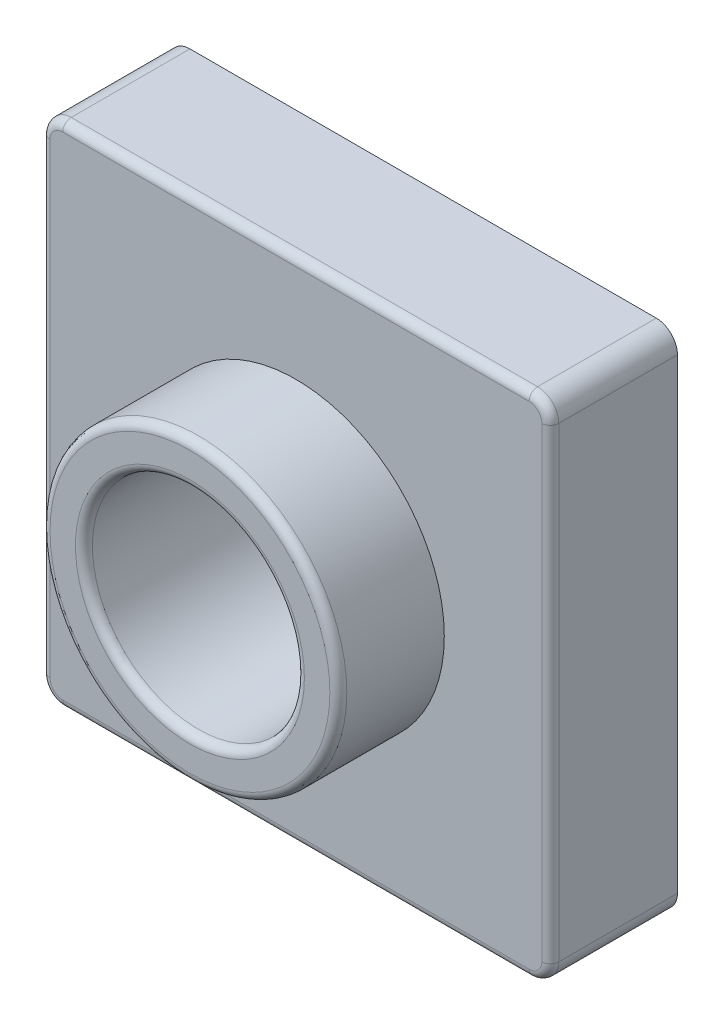
ISO-10303-21;
HEADER;
FILE_DESCRIPTION(('STEP AP214'),'2;1');
FILE_NAME('part.step','',(''),(''),'','','');
FILE_SCHEMA(('AUTOMOTIVE_DESIGN { 1 0 10303 214 1 1 1 1 }'));
ENDSEC;
DATA;
#1=APPLICATION_CONTEXT('core data for automotive mechanical design processes');
#2=APPLICATION_PROTOCOL_DEFINITION('international standard','automotive_design',2000,#1);
#3=PRODUCT_CONTEXT('',#1,'mechanical');
#4=PRODUCT('Part','Part','',(#3));
#5=PRODUCT_RELATED_PRODUCT_CATEGORY('part','',(#4));
#6=PRODUCT_DEFINITION_FORMATION('','',#4);
#7=PRODUCT_DEFINITION_CONTEXT('part definition',#1,'design');
#8=PRODUCT_DEFINITION('design','',#6,#7);
#9=PRODUCT_DEFINITION_SHAPE('','',#8);
#10=(LENGTH_UNIT() NAMED_UNIT(*) SI_UNIT(.MILLI.,.METRE.));
#11=(NAMED_UNIT(*) PLANE_ANGLE_UNIT() SI_UNIT($,.RADIAN.));
#12=(NAMED_UNIT(*) SI_UNIT($,.STERADIAN.) SOLID_ANGLE_UNIT());
#13=UNCERTAINTY_MEASURE_WITH_UNIT(LENGTH_MEASURE(1.E-05),#10,'distance_accuracy_value','');
#14=(GEOMETRIC_REPRESENTATION_CONTEXT(3) GLOBAL_UNCERTAINTY_ASSIGNED_CONTEXT((#13)) GLOBAL_UNIT_ASSIGNED_CONTEXT((#10,
#11,#12)) REPRESENTATION_CONTEXT('',''));
#15=CARTESIAN_POINT('',(0.,0.,0.));
#16=DIRECTION('',(0.,0.,1.));
#17=DIRECTION('',(1.,0.,0.));
#18=AXIS2_PLACEMENT_3D('',#15,#16,#17);
#19=CARTESIAN_POINT('',(0.,0.,0.));
#20=DIRECTION('',(0.,0.,-1.));
#21=DIRECTION('',(-1.,0.,0.));
#22=AXIS2_PLACEMENT_3D('',#19,#20,#21);
#23=PLANE('',#22);
#24=CARTESIAN_POINT('',(60.,60.,0.));
#25=DIRECTION('',(0.,0.,-1.));
#26=DIRECTION('',(-1.,0.,0.));
#27=AXIS2_PLACEMENT_3D('',#24,#25,#26);
#28=CIRCLE('',#27,25.);
#29=CARTESIAN_POINT('',(35.,60.,0.));
#30=VERTEX_POINT('',#29);
#31=EDGE_CURVE('E259',#30,#30,#28,.T.);
#32=ORIENTED_EDGE('',*,*,#31,.F.);
#33=EDGE_LOOP('',(#32));
#34=FACE_BOUND('',#33,.T.);
#35=CARTESIAN_POINT('',(60.,60.,0.));
#36=DIRECTION('',(0.,0.,-1.));
#37=DIRECTION('',(-1.,0.,0.));
#38=AXIS2_PLACEMENT_3D('',#35,#36,#37);
#39=CIRCLE('',#38,27.);
#40=CARTESIAN_POINT('',(33.,60.,0.));
#41=VERTEX_POINT('',#40);
#42=EDGE_CURVE('E245',#41,#41,#39,.T.);
#43=ORIENTED_EDGE('',*,*,#42,.T.);
#44=EDGE_LOOP('',(#43));
#45=FACE_BOUND('',#44,.T.);
#46=ADVANCED_FACE('F35',(#34,#45),#23,.T.);
#47=DIRECTION('',(1.,0.,0.));
#48=VECTOR('',#47,1.);
#49=CARTESIAN_POINT('',(0.,0.,0.));
#50=LINE('',#49,#48);
#51=CARTESIAN_POINT('',(5.,0.,0.));
#52=VERTEX_POINT('',#51);
#53=CARTESIAN_POINT('',(115.,0.,0.));
#54=VERTEX_POINT('',#53);
#55=EDGE_CURVE('E265',#52,#54,#50,.T.);
#56=ORIENTED_EDGE('',*,*,#55,.F.);
#57=CARTESIAN_POINT('',(5.,5.,0.));
#58=DIRECTION('',(0.,0.,-1.));
#59=DIRECTION('',(-1.,0.,0.));
#60=AXIS2_PLACEMENT_3D('',#57,#58,#59);
#61=CIRCLE('',#60,5.);
#62=CARTESIAN_POINT('',(0.,5.,0.));
#63=VERTEX_POINT('',#62);
#64=EDGE_CURVE('E287',#52,#63,#61,.T.);
#65=ORIENTED_EDGE('',*,*,#64,.T.);
#66=DIRECTION('',(0.,-1.,0.));
#67=VECTOR('',#66,1.);
#68=CARTESIAN_POINT('',(0.,0.,0.));
#69=LINE('',#68,#67);
#70=CARTESIAN_POINT('',(0.,115.,0.));
#71=VERTEX_POINT('',#70);
#72=EDGE_CURVE('E262',#71,#63,#69,.T.);
#73=ORIENTED_EDGE('',*,*,#72,.F.);
#74=CARTESIAN_POINT('',(5.,115.,0.));
#75=DIRECTION('',(0.,0.,-1.));
#76=DIRECTION('',(-1.,0.,0.));
#77=AXIS2_PLACEMENT_3D('',#74,#75,#76);
#78=CIRCLE('',#77,5.);
#79=CARTESIAN_POINT('',(5.,120.,0.));
#80=VERTEX_POINT('',#79);
#81=EDGE_CURVE('E281',#71,#80,#78,.T.);
#82=ORIENTED_EDGE('',*,*,#81,.T.);
#83=DIRECTION('',(-1.,0.,0.));
#84=VECTOR('',#83,1.);
#85=CARTESIAN_POINT('',(0.,120.,0.));
#86=LINE('',#85,#84);
#87=CARTESIAN_POINT('',(115.,120.,0.));
#88=VERTEX_POINT('',#87);
#89=EDGE_CURVE('E271',#88,#80,#86,.T.);
#90=ORIENTED_EDGE('',*,*,#89,.F.);
#91=CARTESIAN_POINT('',(115.,115.,0.));
#92=DIRECTION('',(0.,0.,-1.));
#93=DIRECTION('',(-1.,0.,0.));
#94=AXIS2_PLACEMENT_3D('',#91,#92,#93);
#95=CIRCLE('',#94,5.);
#96=CARTESIAN_POINT('',(120.,115.,0.));
#97=VERTEX_POINT('',#96);
#98=EDGE_CURVE('E283',#88,#97,#95,.T.);
#99=ORIENTED_EDGE('',*,*,#98,.T.);
#100=DIRECTION('',(0.,1.,0.));
#101=VECTOR('',#100,1.);
#102=CARTESIAN_POINT('',(120.,0.,0.));
#103=LINE('',#102,#101);
#104=CARTESIAN_POINT('',(120.,5.,0.));
#105=VERTEX_POINT('',#104);
#106=EDGE_CURVE('E268',#105,#97,#103,.T.);
#107=ORIENTED_EDGE('',*,*,#106,.F.);
#108=CARTESIAN_POINT('',(115.,5.,0.));
#109=DIRECTION('',(0.,0.,-1.));
#110=DIRECTION('',(-1.,0.,0.));
#111=AXIS2_PLACEMENT_3D('',#108,#109,#110);
#112=CIRCLE('',#111,5.);
#113=EDGE_CURVE('E285',#105,#54,#112,.T.);
#114=ORIENTED_EDGE('',*,*,#113,.T.);
#115=EDGE_LOOP('',(#56,#65,#73,#82,#90,#99,#107,#114));
#116=FACE_BOUND('',#115,.T.);
#117=CARTESIAN_POINT('',(5.,5.,0.));
#118=DIRECTION('',(0.,0.,-1.));
#119=DIRECTION('',(-1.,0.,0.));
#120=AXIS2_PLACEMENT_3D('',#117,#118,#119);
#121=CIRCLE('',#120,3.);
#122=CARTESIAN_POINT('',(5.,2.,0.));
#123=VERTEX_POINT('',#122);
#124=CARTESIAN_POINT('',(2.,5.,0.));
#125=VERTEX_POINT('',#124);
#126=EDGE_CURVE('E200',#123,#125,#121,.T.);
#127=ORIENTED_EDGE('',*,*,#126,.F.);
#128=DIRECTION('',(1.,0.,0.));
#129=VECTOR('',#128,1.);
#130=CARTESIAN_POINT('',(0.,2.,0.));
#131=LINE('',#130,#129);
#132=CARTESIAN_POINT('',(115.,2.,0.));
#133=VERTEX_POINT('',#132);
#134=EDGE_CURVE('E244',#123,#133,#131,.T.);
#135=ORIENTED_EDGE('',*,*,#134,.T.);
#136=CARTESIAN_POINT('',(115.,5.,0.));
#137=DIRECTION('',(0.,0.,-1.));
#138=DIRECTION('',(-1.,0.,0.));
#139=AXIS2_PLACEMENT_3D('',#136,#137,#138);
#140=CIRCLE('',#139,3.);
#141=CARTESIAN_POINT('',(118.,5.,0.));
#142=VERTEX_POINT('',#141);
#143=EDGE_CURVE('E251',#142,#133,#140,.T.);
#144=ORIENTED_EDGE('',*,*,#143,.F.);
#145=DIRECTION('',(0.,1.,0.));
#146=VECTOR('',#145,1.);
#147=CARTESIAN_POINT('',(118.,0.,0.));
#148=LINE('',#147,#146);
#149=CARTESIAN_POINT('',(118.,115.,0.));
#150=VERTEX_POINT('',#149);
#151=EDGE_CURVE('E52',#142,#150,#148,.T.);
#152=ORIENTED_EDGE('',*,*,#151,.T.);
#153=CARTESIAN_POINT('',(115.,115.,0.));
#154=DIRECTION('',(0.,0.,-1.));
#155=DIRECTION('',(-1.,0.,0.));
#156=AXIS2_PLACEMENT_3D('',#153,#154,#155);
#157=CIRCLE('',#156,3.);
#158=CARTESIAN_POINT('',(115.,118.,0.));
#159=VERTEX_POINT('',#158);
#160=EDGE_CURVE('E247',#159,#150,#157,.T.);
#161=ORIENTED_EDGE('',*,*,#160,.F.);
#162=DIRECTION('',(-1.,0.,0.));
#163=VECTOR('',#162,1.);
#164=CARTESIAN_POINT('',(0.,118.,0.));
#165=LINE('',#164,#163);
#166=CARTESIAN_POINT('',(5.,118.,0.));
#167=VERTEX_POINT('',#166);
#168=EDGE_CURVE('E226',#159,#167,#165,.T.);
#169=ORIENTED_EDGE('',*,*,#168,.T.);
#170=CARTESIAN_POINT('',(5.,115.,0.));
#171=DIRECTION('',(0.,0.,-1.));
#172=DIRECTION('',(-1.,0.,0.));
#173=AXIS2_PLACEMENT_3D('',#170,#171,#172);
#174=CIRCLE('',#173,3.);
#175=CARTESIAN_POINT('',(2.,115.,0.));
#176=VERTEX_POINT('',#175);
#177=EDGE_CURVE('E231',#176,#167,#174,.T.);
#178=ORIENTED_EDGE('',*,*,#177,.F.);
#179=DIRECTION('',(0.,-1.,0.));
#180=VECTOR('',#179,1.);
#181=CARTESIAN_POINT('',(2.,0.,0.));
#182=LINE('',#181,#180);
#183=EDGE_CURVE('E242',#176,#125,#182,.T.);
#184=ORIENTED_EDGE('',*,*,#183,.T.);
#185=EDGE_LOOP('',(#127,#135,#144,#152,#161,#169,#178,#184));
#186=FACE_BOUND('',#185,.T.);
#187=ADVANCED_FACE('F384',(#116,#186),#23,.T.);
#188=CARTESIAN_POINT('',(0.,0.,30.));
#189=DIRECTION('',(1.,0.,0.));
#190=DIRECTION('',(0.,0.,-1.));
#191=AXIS2_PLACEMENT_3D('',#188,#189,#190);
#192=PLANE('',#191);
#193=DIRECTION('',(0.,0.,-1.));
#194=VECTOR('',#193,1.);
#195=CARTESIAN_POINT('',(0.,5.,30.));
#196=LINE('',#195,#194);
#197=CARTESIAN_POINT('',(0.,5.,28.));
#198=VERTEX_POINT('',#197);
#199=EDGE_CURVE('E291',#63,#198,#196,.F.);
#200=ORIENTED_EDGE('',*,*,#199,.T.);
#201=DIRECTION('',(0.,-1.,0.));
#202=VECTOR('',#201,1.);
#203=CARTESIAN_POINT('',(0.,0.,28.));
#204=LINE('',#203,#202);
#205=CARTESIAN_POINT('',(0.,115.,28.));
#206=VERTEX_POINT('',#205);
#207=EDGE_CURVE('E335',#198,#206,#204,.F.);
#208=ORIENTED_EDGE('',*,*,#207,.T.);
#209=DIRECTION('',(0.,0.,-1.));
#210=VECTOR('',#209,1.);
#211=CARTESIAN_POINT('',(0.,115.,30.));
#212=LINE('',#211,#210);
#213=EDGE_CURVE('E289',#206,#71,#212,.T.);
#214=ORIENTED_EDGE('',*,*,#213,.T.);
#215=ORIENTED_EDGE('',*,*,#72,.T.);
#216=EDGE_LOOP('',(#200,#208,#214,#215));
#217=FACE_BOUND('',#216,.T.);
#218=ADVANCED_FACE('F422',(#217),#192,.F.);
#219=CARTESIAN_POINT('',(0.,0.,30.));
#220=DIRECTION('',(0.,1.,0.));
#221=DIRECTION('',(0.,0.,1.));
#222=AXIS2_PLACEMENT_3D('',#219,#220,#221);
#223=PLANE('',#222);
#224=DIRECTION('',(0.,0.,-1.));
#225=VECTOR('',#224,1.);
#226=CARTESIAN_POINT('',(115.,0.,30.));
#227=LINE('',#226,#225);
#228=CARTESIAN_POINT('',(115.,0.,28.));
#229=VERTEX_POINT('',#228);
#230=EDGE_CURVE('E277',#54,#229,#227,.F.);
#231=ORIENTED_EDGE('',*,*,#230,.T.);
#232=DIRECTION('',(1.,0.,0.));
#233=VECTOR('',#232,1.);
#234=CARTESIAN_POINT('',(0.,0.,28.));
#235=LINE('',#234,#233);
#236=CARTESIAN_POINT('',(5.,0.,28.));
#237=VERTEX_POINT('',#236);
#238=EDGE_CURVE('E60',#229,#237,#235,.F.);
#239=ORIENTED_EDGE('',*,*,#238,.T.);
#240=DIRECTION('',(0.,0.,-1.));
#241=VECTOR('',#240,1.);
#242=CARTESIAN_POINT('',(5.,0.,30.));
#243=LINE('',#242,#241);
#244=EDGE_CURVE('E279',#237,#52,#243,.T.);
#245=ORIENTED_EDGE('',*,*,#244,.T.);
#246=ORIENTED_EDGE('',*,*,#55,.T.);
#247=EDGE_LOOP('',(#231,#239,#245,#246));
#248=FACE_BOUND('',#247,.T.);
#249=ADVANCED_FACE('F380',(#248),#223,.F.);
#250=CARTESIAN_POINT('',(120.,0.,30.));
#251=DIRECTION('',(-1.,0.,0.));
#252=DIRECTION('',(0.,0.,1.));
#253=AXIS2_PLACEMENT_3D('',#250,#251,#252);
#254=PLANE('',#253);
#255=DIRECTION('',(0.,0.,-1.));
#256=VECTOR('',#255,1.);
#257=CARTESIAN_POINT('',(120.,115.,30.));
#258=LINE('',#257,#256);
#259=CARTESIAN_POINT('',(120.,115.,28.));
#260=VERTEX_POINT('',#259);
#261=EDGE_CURVE('E294',#97,#260,#258,.F.);
#262=ORIENTED_EDGE('',*,*,#261,.T.);
#263=DIRECTION('',(0.,1.,0.));
#264=VECTOR('',#263,1.);
#265=CARTESIAN_POINT('',(120.,0.,28.));
#266=LINE('',#265,#264);
#267=CARTESIAN_POINT('',(120.,5.,28.));
#268=VERTEX_POINT('',#267);
#269=EDGE_CURVE('E330',#260,#268,#266,.F.);
#270=ORIENTED_EDGE('',*,*,#269,.T.);
#271=DIRECTION('',(0.,0.,-1.));
#272=VECTOR('',#271,1.);
#273=CARTESIAN_POINT('',(120.,5.,30.));
#274=LINE('',#273,#272);
#275=EDGE_CURVE('E297',#268,#105,#274,.T.);
#276=ORIENTED_EDGE('',*,*,#275,.T.);
#277=ORIENTED_EDGE('',*,*,#106,.T.);
#278=EDGE_LOOP('',(#262,#270,#276,#277));
#279=FACE_BOUND('',#278,.T.);
#280=ADVANCED_FACE('F392',(#279),#254,.F.);
#281=CARTESIAN_POINT('',(0.,120.,30.));
#282=DIRECTION('',(0.,-1.,0.));
#283=DIRECTION('',(0.,0.,-1.));
#284=AXIS2_PLACEMENT_3D('',#281,#282,#283);
#285=PLANE('',#284);
#286=DIRECTION('',(0.,0.,-1.));
#287=VECTOR('',#286,1.);
#288=CARTESIAN_POINT('',(5.,120.,30.));
#289=LINE('',#288,#287);
#290=CARTESIAN_POINT('',(5.,120.,28.));
#291=VERTEX_POINT('',#290);
#292=EDGE_CURVE('E299',#80,#291,#289,.F.);
#293=ORIENTED_EDGE('',*,*,#292,.T.);
#294=DIRECTION('',(-1.,0.,0.));
#295=VECTOR('',#294,1.);
#296=CARTESIAN_POINT('',(0.,120.,28.));
#297=LINE('',#296,#295);
#298=CARTESIAN_POINT('',(115.,120.,28.));
#299=VERTEX_POINT('',#298);
#300=EDGE_CURVE('E333',#291,#299,#297,.F.);
#301=ORIENTED_EDGE('',*,*,#300,.T.);
#302=DIRECTION('',(0.,0.,-1.));
#303=VECTOR('',#302,1.);
#304=CARTESIAN_POINT('',(115.,120.,30.));
#305=LINE('',#304,#303);
#306=EDGE_CURVE('E302',#299,#88,#305,.T.);
#307=ORIENTED_EDGE('',*,*,#306,.T.);
#308=ORIENTED_EDGE('',*,*,#89,.T.);
#309=EDGE_LOOP('',(#293,#301,#307,#308));
#310=FACE_BOUND('',#309,.T.);
#311=ADVANCED_FACE('F428',(#310),#285,.F.);
#312=CARTESIAN_POINT('',(0.,0.,30.));
#313=DIRECTION('',(0.,0.,-1.));
#314=DIRECTION('',(-1.,0.,0.));
#315=AXIS2_PLACEMENT_3D('',#312,#313,#314);
#316=PLANE('',#315);
#317=CARTESIAN_POINT('',(115.,5.,30.));
#318=DIRECTION('',(0.,0.,-1.));
#319=DIRECTION('',(-1.,0.,0.));
#320=AXIS2_PLACEMENT_3D('',#317,#318,#319);
#321=CIRCLE('',#320,3.);
#322=CARTESIAN_POINT('',(115.,2.,30.));
#323=VERTEX_POINT('',#322);
#324=CARTESIAN_POINT('',(118.,5.,30.));
#325=VERTEX_POINT('',#324);
#326=EDGE_CURVE('E315',#323,#325,#321,.F.);
#327=ORIENTED_EDGE('',*,*,#326,.T.);
#328=DIRECTION('',(0.,1.,0.));
#329=VECTOR('',#328,1.);
#330=CARTESIAN_POINT('',(118.,0.,30.));
#331=LINE('',#330,#329);
#332=CARTESIAN_POINT('',(118.,115.,30.));
#333=VERTEX_POINT('',#332);
#334=EDGE_CURVE('E319',#325,#333,#331,.T.);
#335=ORIENTED_EDGE('',*,*,#334,.T.);
#336=CARTESIAN_POINT('',(115.,115.,30.));
#337=DIRECTION('',(0.,0.,-1.));
#338=DIRECTION('',(-1.,0.,0.));
#339=AXIS2_PLACEMENT_3D('',#336,#337,#338);
#340=CIRCLE('',#339,3.);
#341=CARTESIAN_POINT('',(115.,118.,30.));
#342=VERTEX_POINT('',#341);
#343=EDGE_CURVE('E317',#333,#342,#340,.F.);
#344=ORIENTED_EDGE('',*,*,#343,.T.);
#345=DIRECTION('',(-1.,0.,0.));
#346=VECTOR('',#345,1.);
#347=CARTESIAN_POINT('',(0.,118.,30.));
#348=LINE('',#347,#346);
#349=CARTESIAN_POINT('',(5.,118.,30.));
#350=VERTEX_POINT('',#349);
#351=EDGE_CURVE('E311',#342,#350,#348,.T.);
#352=ORIENTED_EDGE('',*,*,#351,.T.);
#353=CARTESIAN_POINT('',(5.,115.,30.));
#354=DIRECTION('',(0.,0.,-1.));
#355=DIRECTION('',(-1.,0.,0.));
#356=AXIS2_PLACEMENT_3D('',#353,#354,#355);
#357=CIRCLE('',#356,3.);
#358=CARTESIAN_POINT('',(2.,115.,30.));
#359=VERTEX_POINT('',#358);
#360=EDGE_CURVE('E308',#350,#359,#357,.F.);
#361=ORIENTED_EDGE('',*,*,#360,.T.);
#362=DIRECTION('',(0.,-1.,0.));
#363=VECTOR('',#362,1.);
#364=CARTESIAN_POINT('',(2.,0.,30.));
#365=LINE('',#364,#363);
#366=CARTESIAN_POINT('',(2.,5.,30.));
#367=VERTEX_POINT('',#366);
#368=EDGE_CURVE('E304',#359,#367,#365,.T.);
#369=ORIENTED_EDGE('',*,*,#368,.T.);
#370=CARTESIAN_POINT('',(5.,5.,30.));
#371=DIRECTION('',(0.,0.,-1.));
#372=DIRECTION('',(-1.,0.,0.));
#373=AXIS2_PLACEMENT_3D('',#370,#371,#372);
#374=CIRCLE('',#373,3.);
#375=CARTESIAN_POINT('',(5.,2.,30.));
#376=VERTEX_POINT('',#375);
#377=EDGE_CURVE('E306',#367,#376,#374,.F.);
#378=ORIENTED_EDGE('',*,*,#377,.T.);
#379=DIRECTION('',(1.,0.,0.));
#380=VECTOR('',#379,1.);
#381=CARTESIAN_POINT('',(0.,2.,30.));
#382=LINE('',#381,#380);
#383=EDGE_CURVE('E313',#376,#323,#382,.T.);
#384=ORIENTED_EDGE('',*,*,#383,.T.);
#385=EDGE_LOOP('',(#327,#335,#344,#352,#361,#369,#378,#384));
#386=FACE_BOUND('',#385,.T.);
#387=CARTESIAN_POINT('',(60.,60.,30.));
#388=DIRECTION('',(0.,0.,-1.));
#389=DIRECTION('',(-1.,0.,0.));
#390=AXIS2_PLACEMENT_3D('',#387,#388,#389);
#391=CIRCLE('',#390,35.);
#392=CARTESIAN_POINT('',(25.,60.,30.));
#393=VERTEX_POINT('',#392);
#394=EDGE_CURVE('E274',#393,#393,#391,.F.);
#395=ORIENTED_EDGE('',*,*,#394,.F.);
#396=EDGE_LOOP('',(#395));
#397=FACE_BOUND('',#396,.T.);
#398=ADVANCED_FACE('F408',(#386,#397),#316,.F.);
#399=CARTESIAN_POINT('',(60.,60.,55.));
#400=DIRECTION('',(0.,0.,-1.));
#401=DIRECTION('',(-1.,0.,0.));
#402=AXIS2_PLACEMENT_3D('',#399,#400,#401);
#403=CYLINDRICAL_SURFACE('',#402,35.);
#404=CARTESIAN_POINT('',(60.,60.,53.));
#405=DIRECTION('',(0.,0.,1.));
#406=DIRECTION('',(1.,0.,0.));
#407=AXIS2_PLACEMENT_3D('',#404,#405,#406);
#408=CIRCLE('',#407,35.);
#409=CARTESIAN_POINT('',(95.,60.,53.));
#410=VERTEX_POINT('',#409);
#411=EDGE_CURVE('E11',#410,#410,#408,.F.);
#412=ORIENTED_EDGE('',*,*,#411,.T.);
#413=EDGE_LOOP('',(#412));
#414=FACE_BOUND('',#413,.T.);
#415=ORIENTED_EDGE('',*,*,#394,.T.);
#416=EDGE_LOOP('',(#415));
#417=FACE_BOUND('',#416,.T.);
#418=ADVANCED_FACE('F499',(#414,#417),#403,.T.);
#419=CARTESIAN_POINT('',(60.,60.,55.));
#420=DIRECTION('',(0.,0.,1.));
#421=DIRECTION('',(1.,0.,0.));
#422=AXIS2_PLACEMENT_3D('',#419,#420,#421);
#423=PLANE('',#422);
#424=CARTESIAN_POINT('',(60.,60.,55.));
#425=DIRECTION('',(0.,0.,1.));
#426=DIRECTION('',(1.,0.,0.));
#427=AXIS2_PLACEMENT_3D('',#424,#425,#426);
#428=CIRCLE('',#427,27.);
#429=CARTESIAN_POINT('',(87.,60.,55.));
#430=VERTEX_POINT('',#429);
#431=EDGE_CURVE('E44',#430,#430,#428,.F.);
#432=ORIENTED_EDGE('',*,*,#431,.T.);
#433=EDGE_LOOP('',(#432));
#434=FACE_BOUND('',#433,.T.);
#435=CARTESIAN_POINT('',(60.,60.,55.));
#436=DIRECTION('',(0.,0.,1.));
#437=DIRECTION('',(1.,0.,0.));
#438=AXIS2_PLACEMENT_3D('',#435,#436,#437);
#439=CIRCLE('',#438,33.);
#440=CARTESIAN_POINT('',(93.,60.,55.));
#441=VERTEX_POINT('',#440);
#442=EDGE_CURVE('E340',#441,#441,#439,.T.);
#443=ORIENTED_EDGE('',*,*,#442,.T.);
#444=EDGE_LOOP('',(#443));
#445=FACE_BOUND('',#444,.T.);
#446=ADVANCED_FACE('F494',(#434,#445),#423,.T.);
#447=CARTESIAN_POINT('',(60.,60.,-12.5));
#448=DIRECTION('',(0.,0.,1.));
#449=DIRECTION('',(1.,0.,0.));
#450=AXIS2_PLACEMENT_3D('',#447,#448,#449);
#451=CYLINDRICAL_SURFACE('',#450,25.);
#452=CARTESIAN_POINT('',(60.,60.,53.));
#453=DIRECTION('',(0.,0.,1.));
#454=DIRECTION('',(1.,0.,0.));
#455=AXIS2_PLACEMENT_3D('',#452,#453,#454);
#456=CIRCLE('',#455,25.);
#457=CARTESIAN_POINT('',(85.,60.,53.));
#458=VERTEX_POINT('',#457);
#459=EDGE_CURVE('E337',#458,#458,#456,.T.);
#460=ORIENTED_EDGE('',*,*,#459,.T.);
#461=EDGE_LOOP('',(#460));
#462=FACE_BOUND('',#461,.T.);
#463=ORIENTED_EDGE('',*,*,#31,.T.);
#464=EDGE_LOOP('',(#463));
#465=FACE_BOUND('',#464,.T.);
#466=ADVANCED_FACE('F467',(#462,#465),#451,.F.);
#467=CARTESIAN_POINT('',(5.,5.,30.));
#468=DIRECTION('',(0.,0.,-1.));
#469=DIRECTION('',(-1.,0.,0.));
#470=AXIS2_PLACEMENT_3D('',#467,#468,#469);
#471=CYLINDRICAL_SURFACE('',#470,5.);
#472=ORIENTED_EDGE('',*,*,#244,.F.);
#473=CARTESIAN_POINT('',(5.,5.,28.));
#474=DIRECTION('',(0.,0.,-1.));
#475=DIRECTION('',(-1.,0.,0.));
#476=AXIS2_PLACEMENT_3D('',#473,#474,#475);
#477=CIRCLE('',#476,5.);
#478=EDGE_CURVE('E328',#237,#198,#477,.T.);
#479=ORIENTED_EDGE('',*,*,#478,.T.);
#480=ORIENTED_EDGE('',*,*,#199,.F.);
#481=ORIENTED_EDGE('',*,*,#64,.F.);
#482=EDGE_LOOP('',(#472,#479,#480,#481));
#483=FACE_BOUND('',#482,.T.);
#484=ADVANCED_FACE('F420',(#483),#471,.T.);
#485=CARTESIAN_POINT('',(115.,5.,30.));
#486=DIRECTION('',(0.,0.,-1.));
#487=DIRECTION('',(-1.,0.,0.));
#488=AXIS2_PLACEMENT_3D('',#485,#486,#487);
#489=CYLINDRICAL_SURFACE('',#488,5.);
#490=ORIENTED_EDGE('',*,*,#275,.F.);
#491=CARTESIAN_POINT('',(115.,5.,28.));
#492=DIRECTION('',(0.,0.,-1.));
#493=DIRECTION('',(-1.,0.,0.));
#494=AXIS2_PLACEMENT_3D('',#491,#492,#493);
#495=CIRCLE('',#494,5.);
#496=EDGE_CURVE('E326',#268,#229,#495,.T.);
#497=ORIENTED_EDGE('',*,*,#496,.T.);
#498=ORIENTED_EDGE('',*,*,#230,.F.);
#499=ORIENTED_EDGE('',*,*,#113,.F.);
#500=EDGE_LOOP('',(#490,#497,#498,#499));
#501=FACE_BOUND('',#500,.T.);
#502=ADVANCED_FACE('F378',(#501),#489,.T.);
#503=CARTESIAN_POINT('',(115.,115.,30.));
#504=DIRECTION('',(0.,0.,-1.));
#505=DIRECTION('',(-1.,0.,0.));
#506=AXIS2_PLACEMENT_3D('',#503,#504,#505);
#507=CYLINDRICAL_SURFACE('',#506,5.);
#508=ORIENTED_EDGE('',*,*,#306,.F.);
#509=CARTESIAN_POINT('',(115.,115.,28.));
#510=DIRECTION('',(0.,0.,-1.));
#511=DIRECTION('',(-1.,0.,0.));
#512=AXIS2_PLACEMENT_3D('',#509,#510,#511);
#513=CIRCLE('',#512,5.);
#514=EDGE_CURVE('E324',#299,#260,#513,.T.);
#515=ORIENTED_EDGE('',*,*,#514,.T.);
#516=ORIENTED_EDGE('',*,*,#261,.F.);
#517=ORIENTED_EDGE('',*,*,#98,.F.);
#518=EDGE_LOOP('',(#508,#515,#516,#517));
#519=FACE_BOUND('',#518,.T.);
#520=ADVANCED_FACE('F395',(#519),#507,.T.);
#521=CARTESIAN_POINT('',(5.,115.,30.));
#522=DIRECTION('',(0.,0.,-1.));
#523=DIRECTION('',(-1.,0.,0.));
#524=AXIS2_PLACEMENT_3D('',#521,#522,#523);
#525=CYLINDRICAL_SURFACE('',#524,5.);
#526=ORIENTED_EDGE('',*,*,#213,.F.);
#527=CARTESIAN_POINT('',(5.,115.,28.));
#528=DIRECTION('',(0.,0.,-1.));
#529=DIRECTION('',(-1.,0.,0.));
#530=AXIS2_PLACEMENT_3D('',#527,#528,#529);
#531=CIRCLE('',#530,5.);
#532=EDGE_CURVE('E321',#206,#291,#531,.T.);
#533=ORIENTED_EDGE('',*,*,#532,.T.);
#534=ORIENTED_EDGE('',*,*,#292,.F.);
#535=ORIENTED_EDGE('',*,*,#81,.F.);
#536=EDGE_LOOP('',(#526,#533,#534,#535));
#537=FACE_BOUND('',#536,.T.);
#538=ADVANCED_FACE('F429',(#537),#525,.T.);
#539=CARTESIAN_POINT('',(115.,5.,28.));
#540=DIRECTION('',(0.,0.,-1.));
#541=DIRECTION('',(-1.,0.,0.));
#542=AXIS2_PLACEMENT_3D('',#539,#540,#541);
#543=TOROIDAL_SURFACE('',#542,3.,2.);
#544=CARTESIAN_POINT('',(115.,2.,28.));
#545=DIRECTION('',(-1.,0.,0.));
#546=DIRECTION('',(0.,0.,1.));
#547=AXIS2_PLACEMENT_3D('',#544,#545,#546);
#548=CIRCLE('',#547,2.);
#549=EDGE_CURVE('E359',#229,#323,#548,.T.);
#550=ORIENTED_EDGE('',*,*,#549,.F.);
#551=ORIENTED_EDGE('',*,*,#496,.F.);
#552=CARTESIAN_POINT('',(118.,5.,28.));
#553=DIRECTION('',(0.,1.,0.));
#554=DIRECTION('',(0.,0.,1.));
#555=AXIS2_PLACEMENT_3D('',#552,#553,#554);
#556=CIRCLE('',#555,2.);
#557=EDGE_CURVE('E39',#325,#268,#556,.T.);
#558=ORIENTED_EDGE('',*,*,#557,.F.);
#559=ORIENTED_EDGE('',*,*,#326,.F.);
#560=EDGE_LOOP('',(#550,#551,#558,#559));
#561=FACE_BOUND('',#560,.T.);
#562=ADVANCED_FACE('F374',(#561),#543,.T.);
#563=CARTESIAN_POINT('',(118.,0.,28.));
#564=DIRECTION('',(0.,1.,0.));
#565=DIRECTION('',(0.,0.,1.));
#566=AXIS2_PLACEMENT_3D('',#563,#564,#565);
#567=CYLINDRICAL_SURFACE('',#566,2.);
#568=ORIENTED_EDGE('',*,*,#557,.T.);
#569=ORIENTED_EDGE('',*,*,#269,.F.);
#570=CARTESIAN_POINT('',(118.,115.,28.));
#571=DIRECTION('',(0.,1.,0.));
#572=DIRECTION('',(0.,0.,1.));
#573=AXIS2_PLACEMENT_3D('',#570,#571,#572);
#574=CIRCLE('',#573,2.);
#575=EDGE_CURVE('E357',#333,#260,#574,.T.);
#576=ORIENTED_EDGE('',*,*,#575,.F.);
#577=ORIENTED_EDGE('',*,*,#334,.F.);
#578=EDGE_LOOP('',(#568,#569,#576,#577));
#579=FACE_BOUND('',#578,.T.);
#580=ADVANCED_FACE('F369',(#579),#567,.T.);
#581=CARTESIAN_POINT('',(0.,2.,28.));
#582=DIRECTION('',(1.,0.,0.));
#583=DIRECTION('',(0.,0.,-1.));
#584=AXIS2_PLACEMENT_3D('',#581,#582,#583);
#585=CYLINDRICAL_SURFACE('',#584,2.);
#586=ORIENTED_EDGE('',*,*,#549,.T.);
#587=ORIENTED_EDGE('',*,*,#383,.F.);
#588=CARTESIAN_POINT('',(5.,2.,28.));
#589=DIRECTION('',(-1.,0.,0.));
#590=DIRECTION('',(0.,0.,1.));
#591=AXIS2_PLACEMENT_3D('',#588,#589,#590);
#592=CIRCLE('',#591,2.);
#593=EDGE_CURVE('E354',#237,#376,#592,.T.);
#594=ORIENTED_EDGE('',*,*,#593,.F.);
#595=ORIENTED_EDGE('',*,*,#238,.F.);
#596=EDGE_LOOP('',(#586,#587,#594,#595));
#597=FACE_BOUND('',#596,.T.);
#598=ADVANCED_FACE('F412',(#597),#585,.T.);
#599=CARTESIAN_POINT('',(115.,115.,28.));
#600=DIRECTION('',(0.,0.,-1.));
#601=DIRECTION('',(-1.,0.,0.));
#602=AXIS2_PLACEMENT_3D('',#599,#600,#601);
#603=TOROIDAL_SURFACE('',#602,3.,2.);
#604=ORIENTED_EDGE('',*,*,#575,.T.);
#605=ORIENTED_EDGE('',*,*,#514,.F.);
#606=CARTESIAN_POINT('',(115.,118.,28.));
#607=DIRECTION('',(-1.,0.,0.));
#608=DIRECTION('',(0.,0.,1.));
#609=AXIS2_PLACEMENT_3D('',#606,#607,#608);
#610=CIRCLE('',#609,2.);
#611=EDGE_CURVE('E351',#342,#299,#610,.T.);
#612=ORIENTED_EDGE('',*,*,#611,.F.);
#613=ORIENTED_EDGE('',*,*,#343,.F.);
#614=EDGE_LOOP('',(#604,#605,#612,#613));
#615=FACE_BOUND('',#614,.T.);
#616=ADVANCED_FACE('F399',(#615),#603,.T.);
#617=CARTESIAN_POINT('',(5.,5.,28.));
#618=DIRECTION('',(0.,0.,-1.));
#619=DIRECTION('',(-1.,0.,0.));
#620=AXIS2_PLACEMENT_3D('',#617,#618,#619);
#621=TOROIDAL_SURFACE('',#620,3.,2.);
#622=ORIENTED_EDGE('',*,*,#593,.T.);
#623=ORIENTED_EDGE('',*,*,#377,.F.);
#624=CARTESIAN_POINT('',(2.,5.,28.));
#625=DIRECTION('',(0.,1.,0.));
#626=DIRECTION('',(0.,0.,1.));
#627=AXIS2_PLACEMENT_3D('',#624,#625,#626);
#628=CIRCLE('',#627,2.);
#629=EDGE_CURVE('E348',#198,#367,#628,.T.);
#630=ORIENTED_EDGE('',*,*,#629,.F.);
#631=ORIENTED_EDGE('',*,*,#478,.F.);
#632=EDGE_LOOP('',(#622,#623,#630,#631));
#633=FACE_BOUND('',#632,.T.);
#634=ADVANCED_FACE('F415',(#633),#621,.T.);
#635=CARTESIAN_POINT('',(0.,118.,28.));
#636=DIRECTION('',(-1.,0.,0.));
#637=DIRECTION('',(0.,0.,1.));
#638=AXIS2_PLACEMENT_3D('',#635,#636,#637);
#639=CYLINDRICAL_SURFACE('',#638,2.);
#640=ORIENTED_EDGE('',*,*,#611,.T.);
#641=ORIENTED_EDGE('',*,*,#300,.F.);
#642=CARTESIAN_POINT('',(5.,118.,28.));
#643=DIRECTION('',(-1.,0.,0.));
#644=DIRECTION('',(0.,0.,1.));
#645=AXIS2_PLACEMENT_3D('',#642,#643,#644);
#646=CIRCLE('',#645,2.);
#647=EDGE_CURVE('E346',#350,#291,#646,.T.);
#648=ORIENTED_EDGE('',*,*,#647,.F.);
#649=ORIENTED_EDGE('',*,*,#351,.F.);
#650=EDGE_LOOP('',(#640,#641,#648,#649));
#651=FACE_BOUND('',#650,.T.);
#652=ADVANCED_FACE('F404',(#651),#639,.T.);
#653=CARTESIAN_POINT('',(2.,0.,28.));
#654=DIRECTION('',(0.,-1.,0.));
#655=DIRECTION('',(0.,0.,-1.));
#656=AXIS2_PLACEMENT_3D('',#653,#654,#655);
#657=CYLINDRICAL_SURFACE('',#656,2.);
#658=ORIENTED_EDGE('',*,*,#629,.T.);
#659=ORIENTED_EDGE('',*,*,#368,.F.);
#660=CARTESIAN_POINT('',(2.,115.,28.));
#661=DIRECTION('',(0.,1.,0.));
#662=DIRECTION('',(0.,0.,1.));
#663=AXIS2_PLACEMENT_3D('',#660,#661,#662);
#664=CIRCLE('',#663,2.);
#665=EDGE_CURVE('E239',#206,#359,#664,.T.);
#666=ORIENTED_EDGE('',*,*,#665,.F.);
#667=ORIENTED_EDGE('',*,*,#207,.F.);
#668=EDGE_LOOP('',(#658,#659,#666,#667));
#669=FACE_BOUND('',#668,.T.);
#670=ADVANCED_FACE('F436',(#669),#657,.T.);
#671=CARTESIAN_POINT('',(5.,115.,28.));
#672=DIRECTION('',(0.,0.,-1.));
#673=DIRECTION('',(-1.,0.,0.));
#674=AXIS2_PLACEMENT_3D('',#671,#672,#673);
#675=TOROIDAL_SURFACE('',#674,3.,2.);
#676=ORIENTED_EDGE('',*,*,#647,.T.);
#677=ORIENTED_EDGE('',*,*,#532,.F.);
#678=ORIENTED_EDGE('',*,*,#665,.T.);
#679=ORIENTED_EDGE('',*,*,#360,.F.);
#680=EDGE_LOOP('',(#676,#677,#678,#679));
#681=FACE_BOUND('',#680,.T.);
#682=ADVANCED_FACE('F433',(#681),#675,.T.);
#683=CARTESIAN_POINT('',(60.,60.,53.));
#684=DIRECTION('',(0.,0.,1.));
#685=DIRECTION('',(1.,0.,0.));
#686=AXIS2_PLACEMENT_3D('',#683,#684,#685);
#687=TOROIDAL_SURFACE('',#686,27.,2.);
#688=ORIENTED_EDGE('',*,*,#431,.F.);
#689=EDGE_LOOP('',(#688));
#690=FACE_BOUND('',#689,.T.);
#691=ORIENTED_EDGE('',*,*,#459,.F.);
#692=EDGE_LOOP('',(#691));
#693=FACE_BOUND('',#692,.T.);
#694=ADVANCED_FACE('F443',(#690,#693),#687,.T.);
#695=CARTESIAN_POINT('',(60.,60.,53.));
#696=DIRECTION('',(0.,0.,1.));
#697=DIRECTION('',(1.,0.,0.));
#698=AXIS2_PLACEMENT_3D('',#695,#696,#697);
#699=TOROIDAL_SURFACE('',#698,33.,2.);
#700=ORIENTED_EDGE('',*,*,#411,.F.);
#701=EDGE_LOOP('',(#700));
#702=FACE_BOUND('',#701,.T.);
#703=ORIENTED_EDGE('',*,*,#442,.F.);
#704=EDGE_LOOP('',(#703));
#705=FACE_BOUND('',#704,.T.);
#706=ADVANCED_FACE('F37',(#702,#705),#699,.T.);
#707=CARTESIAN_POINT('',(2.,0.,30.));
#708=DIRECTION('',(1.,0.,0.));
#709=DIRECTION('',(0.,0.,-1.));
#710=AXIS2_PLACEMENT_3D('',#707,#708,#709);
#711=PLANE('',#710);
#712=DIRECTION('',(0.,0.,-1.));
#713=VECTOR('',#712,1.);
#714=CARTESIAN_POINT('',(2.,5.,30.));
#715=LINE('',#714,#713);
#716=CARTESIAN_POINT('',(2.,5.,28.));
#717=VERTEX_POINT('',#716);
#718=EDGE_CURVE('E182',#125,#717,#715,.F.);
#719=ORIENTED_EDGE('',*,*,#718,.F.);
#720=ORIENTED_EDGE('',*,*,#183,.F.);
#721=DIRECTION('',(0.,0.,-1.));
#722=VECTOR('',#721,1.);
#723=CARTESIAN_POINT('',(2.,115.,30.));
#724=LINE('',#723,#722);
#725=CARTESIAN_POINT('',(2.,115.,28.));
#726=VERTEX_POINT('',#725);
#727=EDGE_CURVE('E184',#726,#176,#724,.T.);
#728=ORIENTED_EDGE('',*,*,#727,.F.);
#729=DIRECTION('',(0.,-1.,0.));
#730=VECTOR('',#729,1.);
#731=CARTESIAN_POINT('',(2.,0.,28.));
#732=LINE('',#731,#730);
#733=EDGE_CURVE('E177',#726,#717,#732,.T.);
#734=ORIENTED_EDGE('',*,*,#733,.T.);
#735=EDGE_LOOP('',(#719,#720,#728,#734));
#736=FACE_BOUND('',#735,.T.);
#737=ADVANCED_FACE('F179',(#736),#711,.T.);
#738=CARTESIAN_POINT('',(0.,2.,30.));
#739=DIRECTION('',(0.,1.,0.));
#740=DIRECTION('',(0.,0.,1.));
#741=AXIS2_PLACEMENT_3D('',#738,#739,#740);
#742=PLANE('',#741);
#743=DIRECTION('',(0.,0.,1.));
#744=VECTOR('',#743,1.);
#745=CARTESIAN_POINT('',(115.,2.,30.));
#746=LINE('',#745,#744);
#747=CARTESIAN_POINT('',(115.,2.,28.));
#748=VERTEX_POINT('',#747);
#749=EDGE_CURVE('E225',#133,#748,#746,.T.);
#750=ORIENTED_EDGE('',*,*,#749,.F.);
#751=ORIENTED_EDGE('',*,*,#134,.F.);
#752=DIRECTION('',(0.,0.,1.));
#753=VECTOR('',#752,1.);
#754=CARTESIAN_POINT('',(5.,2.,30.));
#755=LINE('',#754,#753);
#756=CARTESIAN_POINT('',(5.,2.,28.));
#757=VERTEX_POINT('',#756);
#758=EDGE_CURVE('E229',#757,#123,#755,.F.);
#759=ORIENTED_EDGE('',*,*,#758,.F.);
#760=DIRECTION('',(1.,0.,0.));
#761=VECTOR('',#760,1.);
#762=CARTESIAN_POINT('',(0.,2.,28.));
#763=LINE('',#762,#761);
#764=EDGE_CURVE('E194',#757,#748,#763,.T.);
#765=ORIENTED_EDGE('',*,*,#764,.T.);
#766=EDGE_LOOP('',(#750,#751,#759,#765));
#767=FACE_BOUND('',#766,.T.);
#768=ADVANCED_FACE('F551',(#767),#742,.T.);
#769=CARTESIAN_POINT('',(118.,0.,30.));
#770=DIRECTION('',(-1.,0.,0.));
#771=DIRECTION('',(0.,0.,1.));
#772=AXIS2_PLACEMENT_3D('',#769,#770,#771);
#773=PLANE('',#772);
#774=DIRECTION('',(0.,0.,1.));
#775=VECTOR('',#774,1.);
#776=CARTESIAN_POINT('',(118.,115.,30.));
#777=LINE('',#776,#775);
#778=CARTESIAN_POINT('',(118.,115.,28.));
#779=VERTEX_POINT('',#778);
#780=EDGE_CURVE('E201',#150,#779,#777,.T.);
#781=ORIENTED_EDGE('',*,*,#780,.F.);
#782=ORIENTED_EDGE('',*,*,#151,.F.);
#783=DIRECTION('',(0.,0.,1.));
#784=VECTOR('',#783,1.);
#785=CARTESIAN_POINT('',(118.,5.,30.));
#786=LINE('',#785,#784);
#787=CARTESIAN_POINT('',(118.,5.,28.));
#788=VERTEX_POINT('',#787);
#789=EDGE_CURVE('E203',#788,#142,#786,.F.);
#790=ORIENTED_EDGE('',*,*,#789,.F.);
#791=DIRECTION('',(0.,-1.,0.));
#792=VECTOR('',#791,1.);
#793=CARTESIAN_POINT('',(118.,0.,28.));
#794=LINE('',#793,#792);
#795=EDGE_CURVE('E209',#779,#788,#794,.T.);
#796=ORIENTED_EDGE('',*,*,#795,.F.);
#797=EDGE_LOOP('',(#781,#782,#790,#796));
#798=FACE_BOUND('',#797,.T.);
#799=ADVANCED_FACE('F560',(#798),#773,.T.);
#800=CARTESIAN_POINT('',(0.,118.,30.));
#801=DIRECTION('',(0.,-1.,0.));
#802=DIRECTION('',(0.,0.,-1.));
#803=AXIS2_PLACEMENT_3D('',#800,#801,#802);
#804=PLANE('',#803);
#805=DIRECTION('',(0.,0.,-1.));
#806=VECTOR('',#805,1.);
#807=CARTESIAN_POINT('',(5.,118.,30.));
#808=LINE('',#807,#806);
#809=CARTESIAN_POINT('',(5.,118.,28.));
#810=VERTEX_POINT('',#809);
#811=EDGE_CURVE('E232',#167,#810,#808,.F.);
#812=ORIENTED_EDGE('',*,*,#811,.F.);
#813=ORIENTED_EDGE('',*,*,#168,.F.);
#814=DIRECTION('',(0.,0.,-1.));
#815=VECTOR('',#814,1.);
#816=CARTESIAN_POINT('',(115.,118.,30.));
#817=LINE('',#816,#815);
#818=CARTESIAN_POINT('',(115.,118.,28.));
#819=VERTEX_POINT('',#818);
#820=EDGE_CURVE('E188',#819,#159,#817,.T.);
#821=ORIENTED_EDGE('',*,*,#820,.F.);
#822=DIRECTION('',(1.,0.,0.));
#823=VECTOR('',#822,1.);
#824=CARTESIAN_POINT('',(0.,118.,28.));
#825=LINE('',#824,#823);
#826=EDGE_CURVE('E213',#810,#819,#825,.T.);
#827=ORIENTED_EDGE('',*,*,#826,.F.);
#828=EDGE_LOOP('',(#812,#813,#821,#827));
#829=FACE_BOUND('',#828,.T.);
#830=ADVANCED_FACE('F570',(#829),#804,.T.);
#831=CARTESIAN_POINT('',(0.,0.,28.));
#832=DIRECTION('',(0.,0.,-1.));
#833=DIRECTION('',(-1.,0.,0.));
#834=AXIS2_PLACEMENT_3D('',#831,#832,#833);
#835=PLANE('',#834);
#836=CARTESIAN_POINT('',(115.,5.,28.));
#837=DIRECTION('',(0.,0.,-1.));
#838=DIRECTION('',(-1.,0.,0.));
#839=AXIS2_PLACEMENT_3D('',#836,#837,#838);
#840=CIRCLE('',#839,3.);
#841=EDGE_CURVE('E207',#788,#748,#840,.T.);
#842=ORIENTED_EDGE('',*,*,#841,.T.);
#843=ORIENTED_EDGE('',*,*,#764,.F.);
#844=CARTESIAN_POINT('',(5.,5.,28.));
#845=DIRECTION('',(0.,0.,-1.));
#846=DIRECTION('',(-1.,0.,0.));
#847=AXIS2_PLACEMENT_3D('',#844,#845,#846);
#848=CIRCLE('',#847,3.);
#849=EDGE_CURVE('E187',#717,#757,#848,.F.);
#850=ORIENTED_EDGE('',*,*,#849,.F.);
#851=ORIENTED_EDGE('',*,*,#733,.F.);
#852=CARTESIAN_POINT('',(5.,115.,28.));
#853=DIRECTION('',(0.,0.,-1.));
#854=DIRECTION('',(-1.,0.,0.));
#855=AXIS2_PLACEMENT_3D('',#852,#853,#854);
#856=CIRCLE('',#855,3.);
#857=EDGE_CURVE('E216',#726,#810,#856,.T.);
#858=ORIENTED_EDGE('',*,*,#857,.T.);
#859=ORIENTED_EDGE('',*,*,#826,.T.);
#860=CARTESIAN_POINT('',(115.,115.,28.));
#861=DIRECTION('',(0.,0.,-1.));
#862=DIRECTION('',(-1.,0.,0.));
#863=AXIS2_PLACEMENT_3D('',#860,#861,#862);
#864=CIRCLE('',#863,3.);
#865=EDGE_CURVE('E210',#819,#779,#864,.T.);
#866=ORIENTED_EDGE('',*,*,#865,.T.);
#867=ORIENTED_EDGE('',*,*,#795,.T.);
#868=EDGE_LOOP('',(#842,#843,#850,#851,#858,#859,#866,#867));
#869=FACE_BOUND('',#868,.T.);
#870=CARTESIAN_POINT('',(60.,60.,28.));
#871=DIRECTION('',(0.,0.,-1.));
#872=DIRECTION('',(-1.,0.,0.));
#873=AXIS2_PLACEMENT_3D('',#870,#871,#872);
#874=CIRCLE('',#873,33.);
#875=CARTESIAN_POINT('',(27.,60.,28.));
#876=VERTEX_POINT('',#875);
#877=EDGE_CURVE('E222',#876,#876,#874,.F.);
#878=ORIENTED_EDGE('',*,*,#877,.T.);
#879=EDGE_LOOP('',(#878));
#880=FACE_BOUND('',#879,.T.);
#881=ADVANCED_FACE('F192',(#869,#880),#835,.T.);
#882=CARTESIAN_POINT('',(60.,60.,55.));
#883=DIRECTION('',(0.,0.,-1.));
#884=DIRECTION('',(-1.,0.,0.));
#885=AXIS2_PLACEMENT_3D('',#882,#883,#884);
#886=CYLINDRICAL_SURFACE('',#885,33.);
#887=CARTESIAN_POINT('',(60.,60.,53.));
#888=DIRECTION('',(0.,0.,1.));
#889=DIRECTION('',(1.,0.,0.));
#890=AXIS2_PLACEMENT_3D('',#887,#888,#889);
#891=CIRCLE('',#890,33.);
#892=CARTESIAN_POINT('',(93.,60.,53.));
#893=VERTEX_POINT('',#892);
#894=EDGE_CURVE('E236',#893,#893,#891,.T.);
#895=ORIENTED_EDGE('',*,*,#894,.T.);
#896=EDGE_LOOP('',(#895));
#897=FACE_BOUND('',#896,.T.);
#898=ORIENTED_EDGE('',*,*,#877,.F.);
#899=EDGE_LOOP('',(#898));
#900=FACE_BOUND('',#899,.T.);
#901=ADVANCED_FACE('F588',(#897,#900),#886,.F.);
#902=CARTESIAN_POINT('',(60.,60.,53.));
#903=DIRECTION('',(0.,0.,1.));
#904=DIRECTION('',(1.,0.,0.));
#905=AXIS2_PLACEMENT_3D('',#902,#903,#904);
#906=PLANE('',#905);
#907=CARTESIAN_POINT('',(60.,60.,53.));
#908=DIRECTION('',(0.,0.,1.));
#909=DIRECTION('',(1.,0.,0.));
#910=AXIS2_PLACEMENT_3D('',#907,#908,#909);
#911=CIRCLE('',#910,27.);
#912=CARTESIAN_POINT('',(87.,60.,53.));
#913=VERTEX_POINT('',#912);
#914=EDGE_CURVE('E219',#913,#913,#911,.T.);
#915=ORIENTED_EDGE('',*,*,#914,.T.);
#916=EDGE_LOOP('',(#915));
#917=FACE_BOUND('',#916,.T.);
#918=ORIENTED_EDGE('',*,*,#894,.F.);
#919=EDGE_LOOP('',(#918));
#920=FACE_BOUND('',#919,.T.);
#921=ADVANCED_FACE('F597',(#917,#920),#906,.F.);
#922=CARTESIAN_POINT('',(60.,60.,-12.5));
#923=DIRECTION('',(0.,0.,1.));
#924=DIRECTION('',(1.,0.,0.));
#925=AXIS2_PLACEMENT_3D('',#922,#923,#924);
#926=CYLINDRICAL_SURFACE('',#925,27.);
#927=ORIENTED_EDGE('',*,*,#914,.F.);
#928=EDGE_LOOP('',(#927));
#929=FACE_BOUND('',#928,.T.);
#930=ORIENTED_EDGE('',*,*,#42,.F.);
#931=EDGE_LOOP('',(#930));
#932=FACE_BOUND('',#931,.T.);
#933=ADVANCED_FACE('F607',(#929,#932),#926,.T.);
#934=CARTESIAN_POINT('',(5.,5.,30.));
#935=DIRECTION('',(0.,0.,-1.));
#936=DIRECTION('',(-1.,0.,0.));
#937=AXIS2_PLACEMENT_3D('',#934,#935,#936);
#938=CYLINDRICAL_SURFACE('',#937,3.);
#939=ORIENTED_EDGE('',*,*,#758,.T.);
#940=ORIENTED_EDGE('',*,*,#126,.T.);
#941=ORIENTED_EDGE('',*,*,#718,.T.);
#942=ORIENTED_EDGE('',*,*,#849,.T.);
#943=EDGE_LOOP('',(#939,#940,#941,#942));
#944=FACE_BOUND('',#943,.T.);
#945=ADVANCED_FACE('F198',(#944),#938,.F.);
#946=CARTESIAN_POINT('',(115.,5.,30.));
#947=DIRECTION('',(0.,0.,-1.));
#948=DIRECTION('',(-1.,0.,0.));
#949=AXIS2_PLACEMENT_3D('',#946,#947,#948);
#950=CYLINDRICAL_SURFACE('',#949,3.);
#951=ORIENTED_EDGE('',*,*,#789,.T.);
#952=ORIENTED_EDGE('',*,*,#143,.T.);
#953=ORIENTED_EDGE('',*,*,#749,.T.);
#954=ORIENTED_EDGE('',*,*,#841,.F.);
#955=EDGE_LOOP('',(#951,#952,#953,#954));
#956=FACE_BOUND('',#955,.T.);
#957=ADVANCED_FACE('F626',(#956),#950,.F.);
#958=CARTESIAN_POINT('',(115.,115.,30.));
#959=DIRECTION('',(0.,0.,-1.));
#960=DIRECTION('',(-1.,0.,0.));
#961=AXIS2_PLACEMENT_3D('',#958,#959,#960);
#962=CYLINDRICAL_SURFACE('',#961,3.);
#963=ORIENTED_EDGE('',*,*,#820,.T.);
#964=ORIENTED_EDGE('',*,*,#160,.T.);
#965=ORIENTED_EDGE('',*,*,#780,.T.);
#966=ORIENTED_EDGE('',*,*,#865,.F.);
#967=EDGE_LOOP('',(#963,#964,#965,#966));
#968=FACE_BOUND('',#967,.T.);
#969=ADVANCED_FACE('F635',(#968),#962,.F.);
#970=CARTESIAN_POINT('',(5.,115.,30.));
#971=DIRECTION('',(0.,0.,-1.));
#972=DIRECTION('',(-1.,0.,0.));
#973=AXIS2_PLACEMENT_3D('',#970,#971,#972);
#974=CYLINDRICAL_SURFACE('',#973,3.);
#975=ORIENTED_EDGE('',*,*,#727,.T.);
#976=ORIENTED_EDGE('',*,*,#177,.T.);
#977=ORIENTED_EDGE('',*,*,#811,.T.);
#978=ORIENTED_EDGE('',*,*,#857,.F.);
#979=EDGE_LOOP('',(#975,#976,#977,#978));
#980=FACE_BOUND('',#979,.T.);
#981=ADVANCED_FACE('F503',(#980),#974,.F.);
#982=CLOSED_SHELL('',(#46,#187,#218,#249,#280,#311,#398,#418,#446,#466,#484,#502,#520,#538,#562,
#580,#598,#616,#634,#652,#670,#682,#694,#706,#737,#768,#799,#830,#881,#901,#921,#933,#945,#957,
#969,#981));
#983=MANIFOLD_SOLID_BREP('B2',#982);
#984=ADVANCED_BREP_SHAPE_REPRESENTATION('',(#18,#983),#14);
#985=SHAPE_DEFINITION_REPRESENTATION(#9,#984);
ENDSEC;
END-ISO-10303-21;
